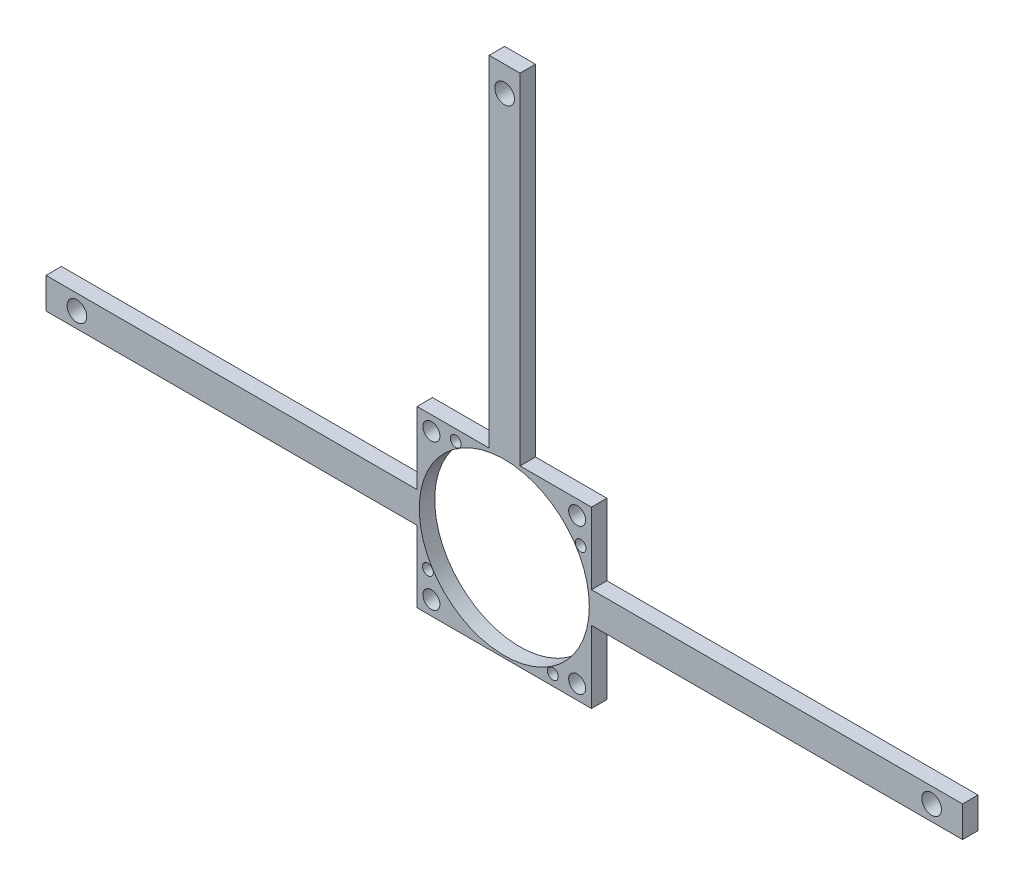
ISO-10303-21;
HEADER;
FILE_DESCRIPTION(('STEP AP214'),'2;1');
FILE_NAME('part.step','',(''),(''),'','','');
FILE_SCHEMA(('AUTOMOTIVE_DESIGN { 1 0 10303 214 1 1 1 1 }'));
ENDSEC;
DATA;
#1=APPLICATION_CONTEXT('core data for automotive mechanical design processes');
#2=APPLICATION_PROTOCOL_DEFINITION('international standard','automotive_design',2000,#1);
#3=PRODUCT_CONTEXT('',#1,'mechanical');
#4=PRODUCT('Part','Part','',(#3));
#5=PRODUCT_RELATED_PRODUCT_CATEGORY('part','',(#4));
#6=PRODUCT_DEFINITION_FORMATION('','',#4);
#7=PRODUCT_DEFINITION_CONTEXT('part definition',#1,'design');
#8=PRODUCT_DEFINITION('design','',#6,#7);
#9=PRODUCT_DEFINITION_SHAPE('','',#8);
#10=(LENGTH_UNIT() NAMED_UNIT(*) SI_UNIT(.MILLI.,.METRE.));
#11=(NAMED_UNIT(*) PLANE_ANGLE_UNIT() SI_UNIT($,.RADIAN.));
#12=(NAMED_UNIT(*) SI_UNIT($,.STERADIAN.) SOLID_ANGLE_UNIT());
#13=UNCERTAINTY_MEASURE_WITH_UNIT(LENGTH_MEASURE(1.E-05),#10,'distance_accuracy_value','');
#14=(GEOMETRIC_REPRESENTATION_CONTEXT(3) GLOBAL_UNCERTAINTY_ASSIGNED_CONTEXT((#13)) GLOBAL_UNIT_ASSIGNED_CONTEXT((#10,
#11,#12)) REPRESENTATION_CONTEXT('',''));
#15=CARTESIAN_POINT('',(0.,0.,0.));
#16=DIRECTION('',(0.,0.,1.));
#17=DIRECTION('',(1.,0.,0.));
#18=AXIS2_PLACEMENT_3D('',#15,#16,#17);
#19=CARTESIAN_POINT('',(0.,0.,5.));
#20=DIRECTION('',(0.,0.,1.));
#21=DIRECTION('',(1.,0.,0.));
#22=AXIS2_PLACEMENT_3D('',#19,#20,#21);
#23=PLANE('',#22);
#24=CARTESIAN_POINT('',(0.101590295881258,70.,5.));
#25=DIRECTION('',(0.,0.,1.));
#26=DIRECTION('',(1.,0.,0.));
#27=AXIS2_PLACEMENT_3D('',#24,#25,#26);
#28=CIRCLE('',#27,3.175);
#29=CARTESIAN_POINT('',(3.27659029588126,70.,5.));
#30=VERTEX_POINT('',#29);
#31=EDGE_CURVE('E368',#30,#30,#28,.T.);
#32=ORIENTED_EDGE('',*,*,#31,.F.);
#33=EDGE_LOOP('',(#32));
#34=FACE_BOUND('',#33,.T.);
#35=CARTESIAN_POINT('',(0.,-60.,5.));
#36=DIRECTION('',(0.,0.,1.));
#37=DIRECTION('',(1.,0.,0.));
#38=AXIS2_PLACEMENT_3D('',#35,#36,#37);
#39=CIRCLE('',#38,27.5);
#40=CARTESIAN_POINT('',(27.5,-60.,5.));
#41=VERTEX_POINT('',#40);
#42=EDGE_CURVE('E381',#41,#41,#39,.T.);
#43=ORIENTED_EDGE('',*,*,#42,.F.);
#44=EDGE_LOOP('',(#43));
#45=FACE_BOUND('',#44,.T.);
#46=CARTESIAN_POINT('',(-138.2,-60.0834875289985,5.));
#47=DIRECTION('',(0.,0.,1.));
#48=DIRECTION('',(1.,0.,0.));
#49=AXIS2_PLACEMENT_3D('',#46,#47,#48);
#50=CIRCLE('',#49,3.175);
#51=CARTESIAN_POINT('',(-135.025,-60.0834875289985,5.));
#52=VERTEX_POINT('',#51);
#53=EDGE_CURVE('E380',#52,#52,#50,.T.);
#54=ORIENTED_EDGE('',*,*,#53,.F.);
#55=EDGE_LOOP('',(#54));
#56=FACE_BOUND('',#55,.T.);
#57=CARTESIAN_POINT('',(138.2,-59.9165124710015,5.));
#58=DIRECTION('',(0.,0.,1.));
#59=DIRECTION('',(1.,0.,0.));
#60=AXIS2_PLACEMENT_3D('',#57,#58,#59);
#61=CIRCLE('',#60,3.175);
#62=CARTESIAN_POINT('',(141.375,-59.9165124710015,5.));
#63=VERTEX_POINT('',#62);
#64=EDGE_CURVE('E374',#63,#63,#61,.T.);
#65=ORIENTED_EDGE('',*,*,#64,.F.);
#66=EDGE_LOOP('',(#65));
#67=FACE_BOUND('',#66,.T.);
#68=CARTESIAN_POINT('',(-24.6999999999999,-75.6999999999999,5.));
#69=DIRECTION('',(0.,0.,1.));
#70=DIRECTION('',(1.,0.,0.));
#71=AXIS2_PLACEMENT_3D('',#68,#69,#70);
#72=CIRCLE('',#71,1.74999999999999);
#73=CARTESIAN_POINT('',(-22.95,-75.6999999999999,5.));
#74=VERTEX_POINT('',#73);
#75=EDGE_CURVE('E391',#74,#74,#72,.T.);
#76=ORIENTED_EDGE('',*,*,#75,.F.);
#77=EDGE_LOOP('',(#76));
#78=FACE_BOUND('',#77,.T.);
#79=CARTESIAN_POINT('',(24.6999999999999,-44.3,5.));
#80=DIRECTION('',(0.,0.,1.));
#81=DIRECTION('',(1.,0.,0.));
#82=AXIS2_PLACEMENT_3D('',#79,#80,#81);
#83=CIRCLE('',#82,1.74777874746956);
#84=CARTESIAN_POINT('',(26.4477787474694,-44.3,5.));
#85=VERTEX_POINT('',#84);
#86=EDGE_CURVE('E403',#85,#85,#83,.T.);
#87=ORIENTED_EDGE('',*,*,#86,.F.);
#88=EDGE_LOOP('',(#87));
#89=FACE_BOUND('',#88,.T.);
#90=CARTESIAN_POINT('',(-23.57,-83.57,5.));
#91=DIRECTION('',(0.,0.,1.));
#92=DIRECTION('',(1.,0.,0.));
#93=AXIS2_PLACEMENT_3D('',#90,#91,#92);
#94=CIRCLE('',#93,2.75);
#95=CARTESIAN_POINT('',(-20.82,-83.57,5.));
#96=VERTEX_POINT('',#95);
#97=EDGE_CURVE('E415',#96,#96,#94,.T.);
#98=ORIENTED_EDGE('',*,*,#97,.F.);
#99=EDGE_LOOP('',(#98));
#100=FACE_BOUND('',#99,.T.);
#101=CARTESIAN_POINT('',(23.57,-36.43,5.));
#102=DIRECTION('',(0.,0.,1.));
#103=DIRECTION('',(1.,0.,0.));
#104=AXIS2_PLACEMENT_3D('',#101,#102,#103);
#105=CIRCLE('',#104,2.75);
#106=CARTESIAN_POINT('',(26.32,-36.43,5.));
#107=VERTEX_POINT('',#106);
#108=EDGE_CURVE('E427',#107,#107,#105,.T.);
#109=ORIENTED_EDGE('',*,*,#108,.F.);
#110=EDGE_LOOP('',(#109));
#111=FACE_BOUND('',#110,.T.);
#112=DIRECTION('',(-1.,0.,0.));
#113=VECTOR('',#112,1.);
#114=CARTESIAN_POINT('',(5.10159029588126,-31.8,5.));
#115=LINE('',#114,#113);
#116=CARTESIAN_POINT('',(28.2,-31.8,5.));
#117=VERTEX_POINT('',#116);
#118=CARTESIAN_POINT('',(5.10159029588126,-31.8,5.));
#119=VERTEX_POINT('',#118);
#120=EDGE_CURVE('E208',#117,#119,#115,.T.);
#121=ORIENTED_EDGE('',*,*,#120,.T.);
#122=DIRECTION('',(0.,1.,0.));
#123=VECTOR('',#122,1.);
#124=CARTESIAN_POINT('',(5.10159029588126,-31.8,5.));
#125=LINE('',#124,#123);
#126=CARTESIAN_POINT('',(5.10159029588126,78.2,5.));
#127=VERTEX_POINT('',#126);
#128=EDGE_CURVE('E116',#119,#127,#125,.T.);
#129=ORIENTED_EDGE('',*,*,#128,.T.);
#130=DIRECTION('',(-1.,0.,0.));
#131=VECTOR('',#130,1.);
#132=CARTESIAN_POINT('',(5.10159029588126,78.2,5.));
#133=LINE('',#132,#131);
#134=CARTESIAN_POINT('',(-4.89840970411874,78.2,5.));
#135=VERTEX_POINT('',#134);
#136=EDGE_CURVE('E247',#127,#135,#133,.T.);
#137=ORIENTED_EDGE('',*,*,#136,.T.);
#138=DIRECTION('',(0.,-1.,0.));
#139=VECTOR('',#138,1.);
#140=CARTESIAN_POINT('',(-4.89840970411874,-31.8,5.));
#141=LINE('',#140,#139);
#142=CARTESIAN_POINT('',(-4.89840970411874,-31.8,5.));
#143=VERTEX_POINT('',#142);
#144=EDGE_CURVE('E266',#135,#143,#141,.T.);
#145=ORIENTED_EDGE('',*,*,#144,.T.);
#146=DIRECTION('',(-1.,0.,0.));
#147=VECTOR('',#146,1.);
#148=CARTESIAN_POINT('',(-28.2,-31.8,5.));
#149=LINE('',#148,#147);
#150=CARTESIAN_POINT('',(-28.2,-31.8,5.));
#151=VERTEX_POINT('',#150);
#152=EDGE_CURVE('E263',#143,#151,#149,.T.);
#153=ORIENTED_EDGE('',*,*,#152,.T.);
#154=DIRECTION('',(0.,-1.,0.));
#155=VECTOR('',#154,1.);
#156=CARTESIAN_POINT('',(-28.2,-55.0834875289985,5.));
#157=LINE('',#156,#155);
#158=CARTESIAN_POINT('',(-28.2,-55.0834875289985,5.));
#159=VERTEX_POINT('',#158);
#160=EDGE_CURVE('E265',#151,#159,#157,.T.);
#161=ORIENTED_EDGE('',*,*,#160,.T.);
#162=DIRECTION('',(-1.,0.,0.));
#163=VECTOR('',#162,1.);
#164=CARTESIAN_POINT('',(-148.2,-55.0834875289985,5.));
#165=LINE('',#164,#163);
#166=CARTESIAN_POINT('',(-148.2,-55.0834875289985,5.));
#167=VERTEX_POINT('',#166);
#168=EDGE_CURVE('E268',#159,#167,#165,.T.);
#169=ORIENTED_EDGE('',*,*,#168,.T.);
#170=DIRECTION('',(0.,-1.,0.));
#171=VECTOR('',#170,1.);
#172=CARTESIAN_POINT('',(-148.2,-55.0834875289985,5.));
#173=LINE('',#172,#171);
#174=CARTESIAN_POINT('',(-148.2,-65.0834875289985,5.));
#175=VERTEX_POINT('',#174);
#176=EDGE_CURVE('E274',#167,#175,#173,.T.);
#177=ORIENTED_EDGE('',*,*,#176,.T.);
#178=DIRECTION('',(1.,0.,0.));
#179=VECTOR('',#178,1.);
#180=CARTESIAN_POINT('',(-148.2,-65.0834875289985,5.));
#181=LINE('',#180,#179);
#182=CARTESIAN_POINT('',(-28.2,-65.0834875289985,5.));
#183=VERTEX_POINT('',#182);
#184=EDGE_CURVE('E276',#175,#183,#181,.T.);
#185=ORIENTED_EDGE('',*,*,#184,.T.);
#186=DIRECTION('',(0.,-1.,0.));
#187=VECTOR('',#186,1.);
#188=CARTESIAN_POINT('',(-28.2,-88.2,5.));
#189=LINE('',#188,#187);
#190=CARTESIAN_POINT('',(-28.2,-88.2,5.));
#191=VERTEX_POINT('',#190);
#192=EDGE_CURVE('E278',#183,#191,#189,.T.);
#193=ORIENTED_EDGE('',*,*,#192,.T.);
#194=DIRECTION('',(1.,0.,0.));
#195=VECTOR('',#194,1.);
#196=CARTESIAN_POINT('',(-28.2,-88.2,5.));
#197=LINE('',#196,#195);
#198=CARTESIAN_POINT('',(28.2,-88.2,5.));
#199=VERTEX_POINT('',#198);
#200=EDGE_CURVE('E280',#191,#199,#197,.T.);
#201=ORIENTED_EDGE('',*,*,#200,.T.);
#202=DIRECTION('',(0.,1.,0.));
#203=VECTOR('',#202,1.);
#204=CARTESIAN_POINT('',(28.2,-88.2,5.));
#205=LINE('',#204,#203);
#206=CARTESIAN_POINT('',(28.2,-64.9165124710015,5.));
#207=VERTEX_POINT('',#206);
#208=EDGE_CURVE('E282',#199,#207,#205,.T.);
#209=ORIENTED_EDGE('',*,*,#208,.T.);
#210=DIRECTION('',(1.,0.,0.));
#211=VECTOR('',#210,1.);
#212=CARTESIAN_POINT('',(28.2,-64.9165124710015,5.));
#213=LINE('',#212,#211);
#214=CARTESIAN_POINT('',(148.2,-64.9165124710015,5.));
#215=VERTEX_POINT('',#214);
#216=EDGE_CURVE('E159',#207,#215,#213,.T.);
#217=ORIENTED_EDGE('',*,*,#216,.T.);
#218=DIRECTION('',(0.,1.,0.));
#219=VECTOR('',#218,1.);
#220=CARTESIAN_POINT('',(148.2,-54.9165124710015,5.));
#221=LINE('',#220,#219);
#222=CARTESIAN_POINT('',(148.2,-54.9165124710015,5.));
#223=VERTEX_POINT('',#222);
#224=EDGE_CURVE('E153',#215,#223,#221,.T.);
#225=ORIENTED_EDGE('',*,*,#224,.T.);
#226=DIRECTION('',(-1.,0.,0.));
#227=VECTOR('',#226,1.);
#228=CARTESIAN_POINT('',(28.2,-54.9165124710015,5.));
#229=LINE('',#228,#227);
#230=CARTESIAN_POINT('',(28.2,-54.9165124710015,5.));
#231=VERTEX_POINT('',#230);
#232=EDGE_CURVE('E157',#223,#231,#229,.T.);
#233=ORIENTED_EDGE('',*,*,#232,.T.);
#234=DIRECTION('',(0.,1.,0.));
#235=VECTOR('',#234,1.);
#236=CARTESIAN_POINT('',(28.2,-54.9165124710015,5.));
#237=LINE('',#236,#235);
#238=EDGE_CURVE('E49',#231,#117,#237,.T.);
#239=ORIENTED_EDGE('',*,*,#238,.T.);
#240=EDGE_LOOP('',(#121,#129,#137,#145,#153,#161,#169,#177,#185,#193,#201,#209,#217,#225,#233,#239));
#241=FACE_BOUND('',#240,.T.);
#242=CARTESIAN_POINT('',(-23.57,-36.43,5.));
#243=DIRECTION('',(0.,0.,1.));
#244=DIRECTION('',(1.,0.,0.));
#245=AXIS2_PLACEMENT_3D('',#242,#243,#244);
#246=CIRCLE('',#245,2.75);
#247=CARTESIAN_POINT('',(-20.82,-36.43,5.));
#248=VERTEX_POINT('',#247);
#249=EDGE_CURVE('E181',#248,#248,#246,.T.);
#250=ORIENTED_EDGE('',*,*,#249,.F.);
#251=EDGE_LOOP('',(#250));
#252=FACE_BOUND('',#251,.T.);
#253=CARTESIAN_POINT('',(23.57,-83.57,5.));
#254=DIRECTION('',(0.,0.,1.));
#255=DIRECTION('',(1.,0.,0.));
#256=AXIS2_PLACEMENT_3D('',#253,#254,#255);
#257=CIRCLE('',#256,2.75);
#258=CARTESIAN_POINT('',(26.32,-83.57,5.));
#259=VERTEX_POINT('',#258);
#260=EDGE_CURVE('E421',#259,#259,#257,.T.);
#261=ORIENTED_EDGE('',*,*,#260,.F.);
#262=EDGE_LOOP('',(#261));
#263=FACE_BOUND('',#262,.T.);
#264=CARTESIAN_POINT('',(-15.7,-35.3,5.));
#265=DIRECTION('',(0.,0.,1.));
#266=DIRECTION('',(1.,0.,0.));
#267=AXIS2_PLACEMENT_3D('',#264,#265,#266);
#268=CIRCLE('',#267,1.74999999999999);
#269=CARTESIAN_POINT('',(-13.95,-35.3,5.));
#270=VERTEX_POINT('',#269);
#271=EDGE_CURVE('E409',#270,#270,#268,.T.);
#272=ORIENTED_EDGE('',*,*,#271,.F.);
#273=EDGE_LOOP('',(#272));
#274=FACE_BOUND('',#273,.T.);
#275=CARTESIAN_POINT('',(15.6999999999999,-84.6999999999998,5.));
#276=DIRECTION('',(0.,0.,1.));
#277=DIRECTION('',(1.,0.,0.));
#278=AXIS2_PLACEMENT_3D('',#275,#276,#277);
#279=CIRCLE('',#278,1.74999999999999);
#280=CARTESIAN_POINT('',(17.4499999999999,-84.6999999999998,5.));
#281=VERTEX_POINT('',#280);
#282=EDGE_CURVE('E397',#281,#281,#279,.T.);
#283=ORIENTED_EDGE('',*,*,#282,.F.);
#284=EDGE_LOOP('',(#283));
#285=FACE_BOUND('',#284,.T.);
#286=ADVANCED_FACE('F32',(#34,#45,#56,#67,#78,#89,#100,#111,#241,#252,#263,#274,#285),#23,.T.);
#287=CARTESIAN_POINT('',(0.,0.,0.));
#288=DIRECTION('',(0.,0.,1.));
#289=DIRECTION('',(1.,0.,0.));
#290=AXIS2_PLACEMENT_3D('',#287,#288,#289);
#291=PLANE('',#290);
#292=CARTESIAN_POINT('',(0.101590295881258,70.,0.));
#293=DIRECTION('',(0.,0.,1.));
#294=DIRECTION('',(1.,0.,0.));
#295=AXIS2_PLACEMENT_3D('',#292,#293,#294);
#296=CIRCLE('',#295,3.175);
#297=CARTESIAN_POINT('',(3.27659029588126,70.,0.));
#298=VERTEX_POINT('',#297);
#299=EDGE_CURVE('E366',#298,#298,#296,.T.);
#300=ORIENTED_EDGE('',*,*,#299,.T.);
#301=EDGE_LOOP('',(#300));
#302=FACE_BOUND('',#301,.T.);
#303=CARTESIAN_POINT('',(0.,-60.,0.));
#304=DIRECTION('',(0.,0.,1.));
#305=DIRECTION('',(1.,0.,0.));
#306=AXIS2_PLACEMENT_3D('',#303,#304,#305);
#307=CIRCLE('',#306,27.5);
#308=CARTESIAN_POINT('',(27.5,-60.,0.));
#309=VERTEX_POINT('',#308);
#310=EDGE_CURVE('E377',#309,#309,#307,.T.);
#311=ORIENTED_EDGE('',*,*,#310,.T.);
#312=EDGE_LOOP('',(#311));
#313=FACE_BOUND('',#312,.T.);
#314=CARTESIAN_POINT('',(-138.2,-60.0834875289985,0.));
#315=DIRECTION('',(0.,0.,1.));
#316=DIRECTION('',(1.,0.,0.));
#317=AXIS2_PLACEMENT_3D('',#314,#315,#316);
#318=CIRCLE('',#317,3.175);
#319=CARTESIAN_POINT('',(-135.025,-60.0834875289985,0.));
#320=VERTEX_POINT('',#319);
#321=EDGE_CURVE('E386',#320,#320,#318,.T.);
#322=ORIENTED_EDGE('',*,*,#321,.T.);
#323=EDGE_LOOP('',(#322));
#324=FACE_BOUND('',#323,.T.);
#325=CARTESIAN_POINT('',(138.2,-59.9165124710015,0.));
#326=DIRECTION('',(0.,0.,1.));
#327=DIRECTION('',(1.,0.,0.));
#328=AXIS2_PLACEMENT_3D('',#325,#326,#327);
#329=CIRCLE('',#328,3.175);
#330=CARTESIAN_POINT('',(141.375,-59.9165124710015,0.));
#331=VERTEX_POINT('',#330);
#332=EDGE_CURVE('E369',#331,#331,#329,.T.);
#333=ORIENTED_EDGE('',*,*,#332,.T.);
#334=EDGE_LOOP('',(#333));
#335=FACE_BOUND('',#334,.T.);
#336=DIRECTION('',(-1.,0.,0.));
#337=VECTOR('',#336,1.);
#338=CARTESIAN_POINT('',(5.10159029588126,-31.8,0.));
#339=LINE('',#338,#337);
#340=CARTESIAN_POINT('',(28.2,-31.8,0.));
#341=VERTEX_POINT('',#340);
#342=CARTESIAN_POINT('',(5.10159029588126,-31.8,0.));
#343=VERTEX_POINT('',#342);
#344=EDGE_CURVE('E177',#341,#343,#339,.T.);
#345=ORIENTED_EDGE('',*,*,#344,.F.);
#346=DIRECTION('',(0.,1.,0.));
#347=VECTOR('',#346,1.);
#348=CARTESIAN_POINT('',(28.2,-54.9165124710015,0.));
#349=LINE('',#348,#347);
#350=CARTESIAN_POINT('',(28.2,-54.9165124710015,0.));
#351=VERTEX_POINT('',#350);
#352=EDGE_CURVE('E108',#351,#341,#349,.T.);
#353=ORIENTED_EDGE('',*,*,#352,.F.);
#354=DIRECTION('',(-1.,0.,0.));
#355=VECTOR('',#354,1.);
#356=CARTESIAN_POINT('',(28.2,-54.9165124710015,0.));
#357=LINE('',#356,#355);
#358=CARTESIAN_POINT('',(148.2,-54.9165124710015,0.));
#359=VERTEX_POINT('',#358);
#360=EDGE_CURVE('E102',#359,#351,#357,.T.);
#361=ORIENTED_EDGE('',*,*,#360,.F.);
#362=DIRECTION('',(0.,1.,0.));
#363=VECTOR('',#362,1.);
#364=CARTESIAN_POINT('',(148.2,-54.9165124710015,0.));
#365=LINE('',#364,#363);
#366=CARTESIAN_POINT('',(148.2,-64.9165124710015,0.));
#367=VERTEX_POINT('',#366);
#368=EDGE_CURVE('E167',#367,#359,#365,.T.);
#369=ORIENTED_EDGE('',*,*,#368,.F.);
#370=DIRECTION('',(1.,0.,0.));
#371=VECTOR('',#370,1.);
#372=CARTESIAN_POINT('',(28.2,-64.9165124710015,0.));
#373=LINE('',#372,#371);
#374=CARTESIAN_POINT('',(28.2,-64.9165124710015,0.));
#375=VERTEX_POINT('',#374);
#376=EDGE_CURVE('E203',#375,#367,#373,.T.);
#377=ORIENTED_EDGE('',*,*,#376,.F.);
#378=DIRECTION('',(0.,1.,0.));
#379=VECTOR('',#378,1.);
#380=CARTESIAN_POINT('',(28.2,-88.2,0.));
#381=LINE('',#380,#379);
#382=CARTESIAN_POINT('',(28.2,-88.2,0.));
#383=VERTEX_POINT('',#382);
#384=EDGE_CURVE('E201',#383,#375,#381,.T.);
#385=ORIENTED_EDGE('',*,*,#384,.F.);
#386=DIRECTION('',(1.,0.,0.));
#387=VECTOR('',#386,1.);
#388=CARTESIAN_POINT('',(-28.2,-88.2,0.));
#389=LINE('',#388,#387);
#390=CARTESIAN_POINT('',(-28.2,-88.2,0.));
#391=VERTEX_POINT('',#390);
#392=EDGE_CURVE('E199',#391,#383,#389,.T.);
#393=ORIENTED_EDGE('',*,*,#392,.F.);
#394=DIRECTION('',(0.,-1.,0.));
#395=VECTOR('',#394,1.);
#396=CARTESIAN_POINT('',(-28.2,-88.2,0.));
#397=LINE('',#396,#395);
#398=CARTESIAN_POINT('',(-28.2,-65.0834875289985,0.));
#399=VERTEX_POINT('',#398);
#400=EDGE_CURVE('E197',#399,#391,#397,.T.);
#401=ORIENTED_EDGE('',*,*,#400,.F.);
#402=DIRECTION('',(1.,0.,0.));
#403=VECTOR('',#402,1.);
#404=CARTESIAN_POINT('',(-148.2,-65.0834875289985,0.));
#405=LINE('',#404,#403);
#406=CARTESIAN_POINT('',(-148.2,-65.0834875289985,0.));
#407=VERTEX_POINT('',#406);
#408=EDGE_CURVE('E195',#407,#399,#405,.T.);
#409=ORIENTED_EDGE('',*,*,#408,.F.);
#410=DIRECTION('',(0.,-1.,0.));
#411=VECTOR('',#410,1.);
#412=CARTESIAN_POINT('',(-148.2,-55.0834875289985,0.));
#413=LINE('',#412,#411);
#414=CARTESIAN_POINT('',(-148.2,-55.0834875289985,0.));
#415=VERTEX_POINT('',#414);
#416=EDGE_CURVE('E193',#415,#407,#413,.T.);
#417=ORIENTED_EDGE('',*,*,#416,.F.);
#418=DIRECTION('',(-1.,0.,0.));
#419=VECTOR('',#418,1.);
#420=CARTESIAN_POINT('',(-148.2,-55.0834875289985,0.));
#421=LINE('',#420,#419);
#422=CARTESIAN_POINT('',(-28.2,-55.0834875289985,0.));
#423=VERTEX_POINT('',#422);
#424=EDGE_CURVE('E191',#423,#415,#421,.T.);
#425=ORIENTED_EDGE('',*,*,#424,.F.);
#426=DIRECTION('',(0.,-1.,0.));
#427=VECTOR('',#426,1.);
#428=CARTESIAN_POINT('',(-28.2,-55.0834875289985,0.));
#429=LINE('',#428,#427);
#430=CARTESIAN_POINT('',(-28.2,-31.8,0.));
#431=VERTEX_POINT('',#430);
#432=EDGE_CURVE('E189',#431,#423,#429,.T.);
#433=ORIENTED_EDGE('',*,*,#432,.F.);
#434=DIRECTION('',(-1.,0.,0.));
#435=VECTOR('',#434,1.);
#436=CARTESIAN_POINT('',(-28.2,-31.8,0.));
#437=LINE('',#436,#435);
#438=CARTESIAN_POINT('',(-4.89840970411874,-31.8,0.));
#439=VERTEX_POINT('',#438);
#440=EDGE_CURVE('E187',#439,#431,#437,.T.);
#441=ORIENTED_EDGE('',*,*,#440,.F.);
#442=DIRECTION('',(0.,-1.,0.));
#443=VECTOR('',#442,1.);
#444=CARTESIAN_POINT('',(-4.89840970411874,-31.8,0.));
#445=LINE('',#444,#443);
#446=CARTESIAN_POINT('',(-4.89840970411874,78.2,0.));
#447=VERTEX_POINT('',#446);
#448=EDGE_CURVE('E185',#447,#439,#445,.T.);
#449=ORIENTED_EDGE('',*,*,#448,.F.);
#450=DIRECTION('',(-1.,0.,0.));
#451=VECTOR('',#450,1.);
#452=CARTESIAN_POINT('',(5.10159029588126,78.2,0.));
#453=LINE('',#452,#451);
#454=CARTESIAN_POINT('',(5.10159029588126,78.2,0.));
#455=VERTEX_POINT('',#454);
#456=EDGE_CURVE('E183',#455,#447,#453,.T.);
#457=ORIENTED_EDGE('',*,*,#456,.F.);
#458=DIRECTION('',(0.,1.,0.));
#459=VECTOR('',#458,1.);
#460=CARTESIAN_POINT('',(5.10159029588126,-31.8,0.));
#461=LINE('',#460,#459);
#462=EDGE_CURVE('E180',#343,#455,#461,.T.);
#463=ORIENTED_EDGE('',*,*,#462,.F.);
#464=EDGE_LOOP('',(#345,#353,#361,#369,#377,#385,#393,#401,#409,#417,#425,#433,#441,#449,#457,#463));
#465=FACE_BOUND('',#464,.T.);
#466=CARTESIAN_POINT('',(-23.57,-36.43,0.));
#467=DIRECTION('',(0.,0.,1.));
#468=DIRECTION('',(1.,0.,0.));
#469=AXIS2_PLACEMENT_3D('',#466,#467,#468);
#470=CIRCLE('',#469,2.75);
#471=CARTESIAN_POINT('',(-20.82,-36.43,0.));
#472=VERTEX_POINT('',#471);
#473=EDGE_CURVE('E430',#472,#472,#470,.T.);
#474=ORIENTED_EDGE('',*,*,#473,.T.);
#475=EDGE_LOOP('',(#474));
#476=FACE_BOUND('',#475,.T.);
#477=CARTESIAN_POINT('',(23.57,-36.43,0.));
#478=DIRECTION('',(0.,0.,1.));
#479=DIRECTION('',(1.,0.,0.));
#480=AXIS2_PLACEMENT_3D('',#477,#478,#479);
#481=CIRCLE('',#480,2.75);
#482=CARTESIAN_POINT('',(26.32,-36.43,0.));
#483=VERTEX_POINT('',#482);
#484=EDGE_CURVE('E424',#483,#483,#481,.T.);
#485=ORIENTED_EDGE('',*,*,#484,.T.);
#486=EDGE_LOOP('',(#485));
#487=FACE_BOUND('',#486,.T.);
#488=CARTESIAN_POINT('',(23.57,-83.57,0.));
#489=DIRECTION('',(0.,0.,1.));
#490=DIRECTION('',(1.,0.,0.));
#491=AXIS2_PLACEMENT_3D('',#488,#489,#490);
#492=CIRCLE('',#491,2.75);
#493=CARTESIAN_POINT('',(26.32,-83.57,0.));
#494=VERTEX_POINT('',#493);
#495=EDGE_CURVE('E418',#494,#494,#492,.T.);
#496=ORIENTED_EDGE('',*,*,#495,.T.);
#497=EDGE_LOOP('',(#496));
#498=FACE_BOUND('',#497,.T.);
#499=CARTESIAN_POINT('',(-23.57,-83.57,0.));
#500=DIRECTION('',(0.,0.,1.));
#501=DIRECTION('',(1.,0.,0.));
#502=AXIS2_PLACEMENT_3D('',#499,#500,#501);
#503=CIRCLE('',#502,2.75);
#504=CARTESIAN_POINT('',(-20.82,-83.57,0.));
#505=VERTEX_POINT('',#504);
#506=EDGE_CURVE('E412',#505,#505,#503,.T.);
#507=ORIENTED_EDGE('',*,*,#506,.T.);
#508=EDGE_LOOP('',(#507));
#509=FACE_BOUND('',#508,.T.);
#510=CARTESIAN_POINT('',(-15.7,-35.3,0.));
#511=DIRECTION('',(0.,0.,1.));
#512=DIRECTION('',(1.,0.,0.));
#513=AXIS2_PLACEMENT_3D('',#510,#511,#512);
#514=CIRCLE('',#513,1.74999999999999);
#515=CARTESIAN_POINT('',(-13.95,-35.3,0.));
#516=VERTEX_POINT('',#515);
#517=EDGE_CURVE('E406',#516,#516,#514,.T.);
#518=ORIENTED_EDGE('',*,*,#517,.T.);
#519=EDGE_LOOP('',(#518));
#520=FACE_BOUND('',#519,.T.);
#521=CARTESIAN_POINT('',(24.6999999999999,-44.3,0.));
#522=DIRECTION('',(0.,0.,1.));
#523=DIRECTION('',(1.,0.,0.));
#524=AXIS2_PLACEMENT_3D('',#521,#522,#523);
#525=CIRCLE('',#524,1.74777874746956);
#526=CARTESIAN_POINT('',(26.4477787474694,-44.3,0.));
#527=VERTEX_POINT('',#526);
#528=EDGE_CURVE('E400',#527,#527,#525,.T.);
#529=ORIENTED_EDGE('',*,*,#528,.T.);
#530=EDGE_LOOP('',(#529));
#531=FACE_BOUND('',#530,.T.);
#532=CARTESIAN_POINT('',(15.6999999999999,-84.6999999999998,0.));
#533=DIRECTION('',(0.,0.,1.));
#534=DIRECTION('',(1.,0.,0.));
#535=AXIS2_PLACEMENT_3D('',#532,#533,#534);
#536=CIRCLE('',#535,1.74999999999999);
#537=CARTESIAN_POINT('',(17.4499999999999,-84.6999999999998,0.));
#538=VERTEX_POINT('',#537);
#539=EDGE_CURVE('E394',#538,#538,#536,.T.);
#540=ORIENTED_EDGE('',*,*,#539,.T.);
#541=EDGE_LOOP('',(#540));
#542=FACE_BOUND('',#541,.T.);
#543=CARTESIAN_POINT('',(-24.6999999999999,-75.6999999999999,0.));
#544=DIRECTION('',(0.,0.,1.));
#545=DIRECTION('',(1.,0.,0.));
#546=AXIS2_PLACEMENT_3D('',#543,#544,#545);
#547=CIRCLE('',#546,1.74999999999999);
#548=CARTESIAN_POINT('',(-22.95,-75.6999999999999,0.));
#549=VERTEX_POINT('',#548);
#550=EDGE_CURVE('E371',#549,#549,#547,.T.);
#551=ORIENTED_EDGE('',*,*,#550,.T.);
#552=EDGE_LOOP('',(#551));
#553=FACE_BOUND('',#552,.T.);
#554=ADVANCED_FACE('F251',(#302,#313,#324,#335,#465,#476,#487,#498,#509,#520,#531,#542,#553),
#291,.F.);
#555=CARTESIAN_POINT('',(5.10159029588126,-31.8,5.));
#556=DIRECTION('',(0.,-1.,0.));
#557=DIRECTION('',(0.,0.,-1.));
#558=AXIS2_PLACEMENT_3D('',#555,#556,#557);
#559=PLANE('',#558);
#560=ORIENTED_EDGE('',*,*,#344,.T.);
#561=DIRECTION('',(0.,0.,-1.));
#562=VECTOR('',#561,1.);
#563=CARTESIAN_POINT('',(5.10159029588126,-31.8,5.));
#564=LINE('',#563,#562);
#565=EDGE_CURVE('E11',#119,#343,#564,.T.);
#566=ORIENTED_EDGE('',*,*,#565,.F.);
#567=ORIENTED_EDGE('',*,*,#120,.F.);
#568=DIRECTION('',(0.,0.,-1.));
#569=VECTOR('',#568,1.);
#570=CARTESIAN_POINT('',(28.2,-31.8,5.));
#571=LINE('',#570,#569);
#572=EDGE_CURVE('E173',#117,#341,#571,.T.);
#573=ORIENTED_EDGE('',*,*,#572,.T.);
#574=EDGE_LOOP('',(#560,#566,#567,#573));
#575=FACE_BOUND('',#574,.T.);
#576=ADVANCED_FACE('F34',(#575),#559,.F.);
#577=CARTESIAN_POINT('',(5.10159029588126,-31.8,5.));
#578=DIRECTION('',(-1.,0.,0.));
#579=DIRECTION('',(0.,0.,1.));
#580=AXIS2_PLACEMENT_3D('',#577,#578,#579);
#581=PLANE('',#580);
#582=ORIENTED_EDGE('',*,*,#462,.T.);
#583=DIRECTION('',(0.,0.,-1.));
#584=VECTOR('',#583,1.);
#585=CARTESIAN_POINT('',(5.10159029588126,78.2,5.));
#586=LINE('',#585,#584);
#587=EDGE_CURVE('E41',#127,#455,#586,.T.);
#588=ORIENTED_EDGE('',*,*,#587,.F.);
#589=ORIENTED_EDGE('',*,*,#128,.F.);
#590=ORIENTED_EDGE('',*,*,#565,.T.);
#591=EDGE_LOOP('',(#582,#588,#589,#590));
#592=FACE_BOUND('',#591,.T.);
#593=ADVANCED_FACE('F654',(#592),#581,.F.);
#594=CARTESIAN_POINT('',(5.10159029588126,78.2,5.));
#595=DIRECTION('',(0.,-1.,0.));
#596=DIRECTION('',(0.,0.,-1.));
#597=AXIS2_PLACEMENT_3D('',#594,#595,#596);
#598=PLANE('',#597);
#599=ORIENTED_EDGE('',*,*,#456,.T.);
#600=DIRECTION('',(0.,0.,-1.));
#601=VECTOR('',#600,1.);
#602=CARTESIAN_POINT('',(-4.89840970411874,78.2,5.));
#603=LINE('',#602,#601);
#604=EDGE_CURVE('E239',#135,#447,#603,.T.);
#605=ORIENTED_EDGE('',*,*,#604,.F.);
#606=ORIENTED_EDGE('',*,*,#136,.F.);
#607=ORIENTED_EDGE('',*,*,#587,.T.);
#608=EDGE_LOOP('',(#599,#605,#606,#607));
#609=FACE_BOUND('',#608,.T.);
#610=ADVANCED_FACE('F245',(#609),#598,.F.);
#611=CARTESIAN_POINT('',(-4.89840970411874,-31.8,5.));
#612=DIRECTION('',(1.,0.,0.));
#613=DIRECTION('',(0.,0.,-1.));
#614=AXIS2_PLACEMENT_3D('',#611,#612,#613);
#615=PLANE('',#614);
#616=ORIENTED_EDGE('',*,*,#448,.T.);
#617=DIRECTION('',(0.,0.,-1.));
#618=VECTOR('',#617,1.);
#619=CARTESIAN_POINT('',(-4.89840970411874,-31.8,5.));
#620=LINE('',#619,#618);
#621=EDGE_CURVE('E236',#143,#439,#620,.T.);
#622=ORIENTED_EDGE('',*,*,#621,.F.);
#623=ORIENTED_EDGE('',*,*,#144,.F.);
#624=ORIENTED_EDGE('',*,*,#604,.T.);
#625=EDGE_LOOP('',(#616,#622,#623,#624));
#626=FACE_BOUND('',#625,.T.);
#627=ADVANCED_FACE('F257',(#626),#615,.F.);
#628=CARTESIAN_POINT('',(-28.2,-31.8,5.));
#629=DIRECTION('',(0.,-1.,0.));
#630=DIRECTION('',(0.,0.,-1.));
#631=AXIS2_PLACEMENT_3D('',#628,#629,#630);
#632=PLANE('',#631);
#633=ORIENTED_EDGE('',*,*,#440,.T.);
#634=DIRECTION('',(0.,0.,-1.));
#635=VECTOR('',#634,1.);
#636=CARTESIAN_POINT('',(-28.2,-31.8,5.));
#637=LINE('',#636,#635);
#638=EDGE_CURVE('E233',#151,#431,#637,.T.);
#639=ORIENTED_EDGE('',*,*,#638,.F.);
#640=ORIENTED_EDGE('',*,*,#152,.F.);
#641=ORIENTED_EDGE('',*,*,#621,.T.);
#642=EDGE_LOOP('',(#633,#639,#640,#641));
#643=FACE_BOUND('',#642,.T.);
#644=ADVANCED_FACE('F261',(#643),#632,.F.);
#645=CARTESIAN_POINT('',(-28.2,-55.0834875289985,5.));
#646=DIRECTION('',(1.,0.,0.));
#647=DIRECTION('',(0.,0.,-1.));
#648=AXIS2_PLACEMENT_3D('',#645,#646,#647);
#649=PLANE('',#648);
#650=ORIENTED_EDGE('',*,*,#432,.T.);
#651=DIRECTION('',(0.,0.,-1.));
#652=VECTOR('',#651,1.);
#653=CARTESIAN_POINT('',(-28.2,-55.0834875289985,5.));
#654=LINE('',#653,#652);
#655=EDGE_CURVE('E230',#159,#423,#654,.T.);
#656=ORIENTED_EDGE('',*,*,#655,.F.);
#657=ORIENTED_EDGE('',*,*,#160,.F.);
#658=ORIENTED_EDGE('',*,*,#638,.T.);
#659=EDGE_LOOP('',(#650,#656,#657,#658));
#660=FACE_BOUND('',#659,.T.);
#661=ADVANCED_FACE('F619',(#660),#649,.F.);
#662=CARTESIAN_POINT('',(-148.2,-55.0834875289985,5.));
#663=DIRECTION('',(0.,-1.,0.));
#664=DIRECTION('',(0.,0.,-1.));
#665=AXIS2_PLACEMENT_3D('',#662,#663,#664);
#666=PLANE('',#665);
#667=ORIENTED_EDGE('',*,*,#424,.T.);
#668=DIRECTION('',(0.,0.,-1.));
#669=VECTOR('',#668,1.);
#670=CARTESIAN_POINT('',(-148.2,-55.0834875289985,5.));
#671=LINE('',#670,#669);
#672=EDGE_CURVE('E227',#167,#415,#671,.T.);
#673=ORIENTED_EDGE('',*,*,#672,.F.);
#674=ORIENTED_EDGE('',*,*,#168,.F.);
#675=ORIENTED_EDGE('',*,*,#655,.T.);
#676=EDGE_LOOP('',(#667,#673,#674,#675));
#677=FACE_BOUND('',#676,.T.);
#678=ADVANCED_FACE('F609',(#677),#666,.F.);
#679=CARTESIAN_POINT('',(-148.2,-55.0834875289985,5.));
#680=DIRECTION('',(1.,0.,0.));
#681=DIRECTION('',(0.,0.,-1.));
#682=AXIS2_PLACEMENT_3D('',#679,#680,#681);
#683=PLANE('',#682);
#684=ORIENTED_EDGE('',*,*,#416,.T.);
#685=DIRECTION('',(0.,0.,-1.));
#686=VECTOR('',#685,1.);
#687=CARTESIAN_POINT('',(-148.2,-65.0834875289985,5.));
#688=LINE('',#687,#686);
#689=EDGE_CURVE('E224',#175,#407,#688,.T.);
#690=ORIENTED_EDGE('',*,*,#689,.F.);
#691=ORIENTED_EDGE('',*,*,#176,.F.);
#692=ORIENTED_EDGE('',*,*,#672,.T.);
#693=EDGE_LOOP('',(#684,#690,#691,#692));
#694=FACE_BOUND('',#693,.T.);
#695=ADVANCED_FACE('F599',(#694),#683,.F.);
#696=CARTESIAN_POINT('',(-148.2,-65.0834875289985,5.));
#697=DIRECTION('',(0.,1.,0.));
#698=DIRECTION('',(0.,0.,1.));
#699=AXIS2_PLACEMENT_3D('',#696,#697,#698);
#700=PLANE('',#699);
#701=ORIENTED_EDGE('',*,*,#408,.T.);
#702=DIRECTION('',(0.,0.,-1.));
#703=VECTOR('',#702,1.);
#704=CARTESIAN_POINT('',(-28.2,-65.0834875289985,5.));
#705=LINE('',#704,#703);
#706=EDGE_CURVE('E221',#183,#399,#705,.T.);
#707=ORIENTED_EDGE('',*,*,#706,.F.);
#708=ORIENTED_EDGE('',*,*,#184,.F.);
#709=ORIENTED_EDGE('',*,*,#689,.T.);
#710=EDGE_LOOP('',(#701,#707,#708,#709));
#711=FACE_BOUND('',#710,.T.);
#712=ADVANCED_FACE('F589',(#711),#700,.F.);
#713=CARTESIAN_POINT('',(-28.2,-88.2,5.));
#714=DIRECTION('',(1.,0.,0.));
#715=DIRECTION('',(0.,0.,-1.));
#716=AXIS2_PLACEMENT_3D('',#713,#714,#715);
#717=PLANE('',#716);
#718=ORIENTED_EDGE('',*,*,#400,.T.);
#719=DIRECTION('',(0.,0.,-1.));
#720=VECTOR('',#719,1.);
#721=CARTESIAN_POINT('',(-28.2,-88.2,5.));
#722=LINE('',#721,#720);
#723=EDGE_CURVE('E218',#191,#391,#722,.T.);
#724=ORIENTED_EDGE('',*,*,#723,.F.);
#725=ORIENTED_EDGE('',*,*,#192,.F.);
#726=ORIENTED_EDGE('',*,*,#706,.T.);
#727=EDGE_LOOP('',(#718,#724,#725,#726));
#728=FACE_BOUND('',#727,.T.);
#729=ADVANCED_FACE('F579',(#728),#717,.F.);
#730=CARTESIAN_POINT('',(-28.2,-88.2,5.));
#731=DIRECTION('',(0.,1.,0.));
#732=DIRECTION('',(0.,0.,1.));
#733=AXIS2_PLACEMENT_3D('',#730,#731,#732);
#734=PLANE('',#733);
#735=ORIENTED_EDGE('',*,*,#392,.T.);
#736=DIRECTION('',(0.,0.,-1.));
#737=VECTOR('',#736,1.);
#738=CARTESIAN_POINT('',(28.2,-88.2,5.));
#739=LINE('',#738,#737);
#740=EDGE_CURVE('E215',#199,#383,#739,.T.);
#741=ORIENTED_EDGE('',*,*,#740,.F.);
#742=ORIENTED_EDGE('',*,*,#200,.F.);
#743=ORIENTED_EDGE('',*,*,#723,.T.);
#744=EDGE_LOOP('',(#735,#741,#742,#743));
#745=FACE_BOUND('',#744,.T.);
#746=ADVANCED_FACE('F570',(#745),#734,.F.);
#747=CARTESIAN_POINT('',(28.2,-88.2,5.));
#748=DIRECTION('',(-1.,0.,0.));
#749=DIRECTION('',(0.,0.,1.));
#750=AXIS2_PLACEMENT_3D('',#747,#748,#749);
#751=PLANE('',#750);
#752=ORIENTED_EDGE('',*,*,#384,.T.);
#753=DIRECTION('',(0.,0.,-1.));
#754=VECTOR('',#753,1.);
#755=CARTESIAN_POINT('',(28.2,-64.9165124710015,5.));
#756=LINE('',#755,#754);
#757=EDGE_CURVE('E212',#207,#375,#756,.T.);
#758=ORIENTED_EDGE('',*,*,#757,.F.);
#759=ORIENTED_EDGE('',*,*,#208,.F.);
#760=ORIENTED_EDGE('',*,*,#740,.T.);
#761=EDGE_LOOP('',(#752,#758,#759,#760));
#762=FACE_BOUND('',#761,.T.);
#763=ADVANCED_FACE('F288',(#762),#751,.F.);
#764=CARTESIAN_POINT('',(28.2,-64.9165124710015,5.));
#765=DIRECTION('',(0.,1.,0.));
#766=DIRECTION('',(-1.,0.,0.));
#767=AXIS2_PLACEMENT_3D('',#764,#765,#766);
#768=PLANE('',#767);
#769=ORIENTED_EDGE('',*,*,#376,.T.);
#770=DIRECTION('',(0.,0.,-1.));
#771=VECTOR('',#770,1.);
#772=CARTESIAN_POINT('',(148.2,-64.9165124710015,5.));
#773=LINE('',#772,#771);
#774=EDGE_CURVE('E168',#215,#367,#773,.T.);
#775=ORIENTED_EDGE('',*,*,#774,.F.);
#776=ORIENTED_EDGE('',*,*,#216,.F.);
#777=ORIENTED_EDGE('',*,*,#757,.T.);
#778=EDGE_LOOP('',(#769,#775,#776,#777));
#779=FACE_BOUND('',#778,.T.);
#780=ADVANCED_FACE('F292',(#779),#768,.F.);
#781=CARTESIAN_POINT('',(148.2,-54.9165124710015,5.));
#782=DIRECTION('',(-1.,0.,0.));
#783=DIRECTION('',(0.,0.,1.));
#784=AXIS2_PLACEMENT_3D('',#781,#782,#783);
#785=PLANE('',#784);
#786=ORIENTED_EDGE('',*,*,#368,.T.);
#787=DIRECTION('',(0.,0.,-1.));
#788=VECTOR('',#787,1.);
#789=CARTESIAN_POINT('',(148.2,-54.9165124710015,5.));
#790=LINE('',#789,#788);
#791=EDGE_CURVE('E164',#223,#359,#790,.T.);
#792=ORIENTED_EDGE('',*,*,#791,.F.);
#793=ORIENTED_EDGE('',*,*,#224,.F.);
#794=ORIENTED_EDGE('',*,*,#774,.T.);
#795=EDGE_LOOP('',(#786,#792,#793,#794));
#796=FACE_BOUND('',#795,.T.);
#797=ADVANCED_FACE('F165',(#796),#785,.F.);
#798=CARTESIAN_POINT('',(28.2,-54.9165124710015,5.));
#799=DIRECTION('',(0.,-1.,0.));
#800=DIRECTION('',(0.,0.,-1.));
#801=AXIS2_PLACEMENT_3D('',#798,#799,#800);
#802=PLANE('',#801);
#803=ORIENTED_EDGE('',*,*,#360,.T.);
#804=DIRECTION('',(0.,0.,-1.));
#805=VECTOR('',#804,1.);
#806=CARTESIAN_POINT('',(28.2,-54.9165124710015,5.));
#807=LINE('',#806,#805);
#808=EDGE_CURVE('E169',#231,#351,#807,.T.);
#809=ORIENTED_EDGE('',*,*,#808,.F.);
#810=ORIENTED_EDGE('',*,*,#232,.F.);
#811=ORIENTED_EDGE('',*,*,#791,.T.);
#812=EDGE_LOOP('',(#803,#809,#810,#811));
#813=FACE_BOUND('',#812,.T.);
#814=ADVANCED_FACE('F171',(#813),#802,.F.);
#815=CARTESIAN_POINT('',(28.2,-54.9165124710015,5.));
#816=DIRECTION('',(-1.,0.,0.));
#817=DIRECTION('',(0.,-1.,0.));
#818=AXIS2_PLACEMENT_3D('',#815,#816,#817);
#819=PLANE('',#818);
#820=ORIENTED_EDGE('',*,*,#352,.T.);
#821=ORIENTED_EDGE('',*,*,#572,.F.);
#822=ORIENTED_EDGE('',*,*,#238,.F.);
#823=ORIENTED_EDGE('',*,*,#808,.T.);
#824=EDGE_LOOP('',(#820,#821,#822,#823));
#825=FACE_BOUND('',#824,.T.);
#826=ADVANCED_FACE('F296',(#825),#819,.F.);
#827=CARTESIAN_POINT('',(-23.57,-36.43,5.));
#828=DIRECTION('',(0.,0.,-1.));
#829=DIRECTION('',(-1.,0.,0.));
#830=AXIS2_PLACEMENT_3D('',#827,#828,#829);
#831=CYLINDRICAL_SURFACE('',#830,2.75);
#832=ORIENTED_EDGE('',*,*,#249,.T.);
#833=EDGE_LOOP('',(#832));
#834=FACE_BOUND('',#833,.T.);
#835=ORIENTED_EDGE('',*,*,#473,.F.);
#836=EDGE_LOOP('',(#835));
#837=FACE_BOUND('',#836,.T.);
#838=ADVANCED_FACE('F298',(#834,#837),#831,.F.);
#839=CARTESIAN_POINT('',(23.57,-36.43,5.));
#840=DIRECTION('',(0.,0.,-1.));
#841=DIRECTION('',(-1.,0.,0.));
#842=AXIS2_PLACEMENT_3D('',#839,#840,#841);
#843=CYLINDRICAL_SURFACE('',#842,2.75);
#844=ORIENTED_EDGE('',*,*,#108,.T.);
#845=EDGE_LOOP('',(#844));
#846=FACE_BOUND('',#845,.T.);
#847=ORIENTED_EDGE('',*,*,#484,.F.);
#848=EDGE_LOOP('',(#847));
#849=FACE_BOUND('',#848,.T.);
#850=ADVANCED_FACE('F304',(#846,#849),#843,.F.);
#851=CARTESIAN_POINT('',(23.57,-83.57,5.));
#852=DIRECTION('',(0.,0.,-1.));
#853=DIRECTION('',(-1.,0.,0.));
#854=AXIS2_PLACEMENT_3D('',#851,#852,#853);
#855=CYLINDRICAL_SURFACE('',#854,2.75);
#856=ORIENTED_EDGE('',*,*,#260,.T.);
#857=EDGE_LOOP('',(#856));
#858=FACE_BOUND('',#857,.T.);
#859=ORIENTED_EDGE('',*,*,#495,.F.);
#860=EDGE_LOOP('',(#859));
#861=FACE_BOUND('',#860,.T.);
#862=ADVANCED_FACE('F321',(#858,#861),#855,.F.);
#863=CARTESIAN_POINT('',(-23.57,-83.57,5.));
#864=DIRECTION('',(0.,0.,-1.));
#865=DIRECTION('',(-1.,0.,0.));
#866=AXIS2_PLACEMENT_3D('',#863,#864,#865);
#867=CYLINDRICAL_SURFACE('',#866,2.75);
#868=ORIENTED_EDGE('',*,*,#97,.T.);
#869=EDGE_LOOP('',(#868));
#870=FACE_BOUND('',#869,.T.);
#871=ORIENTED_EDGE('',*,*,#506,.F.);
#872=EDGE_LOOP('',(#871));
#873=FACE_BOUND('',#872,.T.);
#874=ADVANCED_FACE('F325',(#870,#873),#867,.F.);
#875=CARTESIAN_POINT('',(-15.7,-35.3,5.));
#876=DIRECTION('',(0.,0.,-1.));
#877=DIRECTION('',(-1.,0.,0.));
#878=AXIS2_PLACEMENT_3D('',#875,#876,#877);
#879=CYLINDRICAL_SURFACE('',#878,1.74999999999999);
#880=ORIENTED_EDGE('',*,*,#271,.T.);
#881=EDGE_LOOP('',(#880));
#882=FACE_BOUND('',#881,.T.);
#883=ORIENTED_EDGE('',*,*,#517,.F.);
#884=EDGE_LOOP('',(#883));
#885=FACE_BOUND('',#884,.T.);
#886=ADVANCED_FACE('F329',(#882,#885),#879,.F.);
#887=CARTESIAN_POINT('',(24.6999999999999,-44.3,5.));
#888=DIRECTION('',(0.,0.,-1.));
#889=DIRECTION('',(-1.,0.,0.));
#890=AXIS2_PLACEMENT_3D('',#887,#888,#889);
#891=CYLINDRICAL_SURFACE('',#890,1.74777874746956);
#892=ORIENTED_EDGE('',*,*,#86,.T.);
#893=EDGE_LOOP('',(#892));
#894=FACE_BOUND('',#893,.T.);
#895=ORIENTED_EDGE('',*,*,#528,.F.);
#896=EDGE_LOOP('',(#895));
#897=FACE_BOUND('',#896,.T.);
#898=ADVANCED_FACE('F333',(#894,#897),#891,.F.);
#899=CARTESIAN_POINT('',(15.6999999999999,-84.6999999999998,5.));
#900=DIRECTION('',(0.,0.,-1.));
#901=DIRECTION('',(-1.,0.,0.));
#902=AXIS2_PLACEMENT_3D('',#899,#900,#901);
#903=CYLINDRICAL_SURFACE('',#902,1.74999999999999);
#904=ORIENTED_EDGE('',*,*,#282,.T.);
#905=EDGE_LOOP('',(#904));
#906=FACE_BOUND('',#905,.T.);
#907=ORIENTED_EDGE('',*,*,#539,.F.);
#908=EDGE_LOOP('',(#907));
#909=FACE_BOUND('',#908,.T.);
#910=ADVANCED_FACE('F337',(#906,#909),#903,.F.);
#911=CARTESIAN_POINT('',(-24.6999999999999,-75.6999999999999,5.));
#912=DIRECTION('',(0.,0.,-1.));
#913=DIRECTION('',(-1.,0.,0.));
#914=AXIS2_PLACEMENT_3D('',#911,#912,#913);
#915=CYLINDRICAL_SURFACE('',#914,1.74999999999999);
#916=ORIENTED_EDGE('',*,*,#75,.T.);
#917=EDGE_LOOP('',(#916));
#918=FACE_BOUND('',#917,.T.);
#919=ORIENTED_EDGE('',*,*,#550,.F.);
#920=EDGE_LOOP('',(#919));
#921=FACE_BOUND('',#920,.T.);
#922=ADVANCED_FACE('F341',(#918,#921),#915,.F.);
#923=CARTESIAN_POINT('',(138.2,-59.9165124710015,0.));
#924=DIRECTION('',(0.,0.,1.));
#925=DIRECTION('',(1.,0.,0.));
#926=AXIS2_PLACEMENT_3D('',#923,#924,#925);
#927=CYLINDRICAL_SURFACE('',#926,3.175);
#928=ORIENTED_EDGE('',*,*,#332,.F.);
#929=EDGE_LOOP('',(#928));
#930=FACE_BOUND('',#929,.T.);
#931=ORIENTED_EDGE('',*,*,#64,.T.);
#932=EDGE_LOOP('',(#931));
#933=FACE_BOUND('',#932,.T.);
#934=ADVANCED_FACE('F345',(#930,#933),#927,.F.);
#935=CARTESIAN_POINT('',(-138.2,-60.0834875289985,0.));
#936=DIRECTION('',(0.,0.,1.));
#937=DIRECTION('',(1.,0.,0.));
#938=AXIS2_PLACEMENT_3D('',#935,#936,#937);
#939=CYLINDRICAL_SURFACE('',#938,3.175);
#940=ORIENTED_EDGE('',*,*,#321,.F.);
#941=EDGE_LOOP('',(#940));
#942=FACE_BOUND('',#941,.T.);
#943=ORIENTED_EDGE('',*,*,#53,.T.);
#944=EDGE_LOOP('',(#943));
#945=FACE_BOUND('',#944,.T.);
#946=ADVANCED_FACE('F347',(#942,#945),#939,.F.);
#947=CARTESIAN_POINT('',(0.,-60.,0.));
#948=DIRECTION('',(0.,0.,1.));
#949=DIRECTION('',(1.,0.,0.));
#950=AXIS2_PLACEMENT_3D('',#947,#948,#949);
#951=CYLINDRICAL_SURFACE('',#950,27.5);
#952=ORIENTED_EDGE('',*,*,#310,.F.);
#953=EDGE_LOOP('',(#952));
#954=FACE_BOUND('',#953,.T.);
#955=ORIENTED_EDGE('',*,*,#42,.T.);
#956=EDGE_LOOP('',(#955));
#957=FACE_BOUND('',#956,.T.);
#958=ADVANCED_FACE('F350',(#954,#957),#951,.F.);
#959=CARTESIAN_POINT('',(0.101590295881258,70.,0.));
#960=DIRECTION('',(0.,0.,1.));
#961=DIRECTION('',(1.,0.,0.));
#962=AXIS2_PLACEMENT_3D('',#959,#960,#961);
#963=CYLINDRICAL_SURFACE('',#962,3.175);
#964=ORIENTED_EDGE('',*,*,#299,.F.);
#965=EDGE_LOOP('',(#964));
#966=FACE_BOUND('',#965,.T.);
#967=ORIENTED_EDGE('',*,*,#31,.T.);
#968=EDGE_LOOP('',(#967));
#969=FACE_BOUND('',#968,.T.);
#970=ADVANCED_FACE('F357',(#966,#969),#963,.F.);
#971=CLOSED_SHELL('',(#286,#554,#576,#593,#610,#627,#644,#661,#678,#695,#712,#729,#746,#763,
#780,#797,#814,#826,#838,#850,#862,#874,#886,#898,#910,#922,#934,#946,#958,#970));
#972=MANIFOLD_SOLID_BREP('B2',#971);
#973=ADVANCED_BREP_SHAPE_REPRESENTATION('',(#18,#972),#14);
#974=SHAPE_DEFINITION_REPRESENTATION(#9,#973);
ENDSEC;
END-ISO-10303-21;
